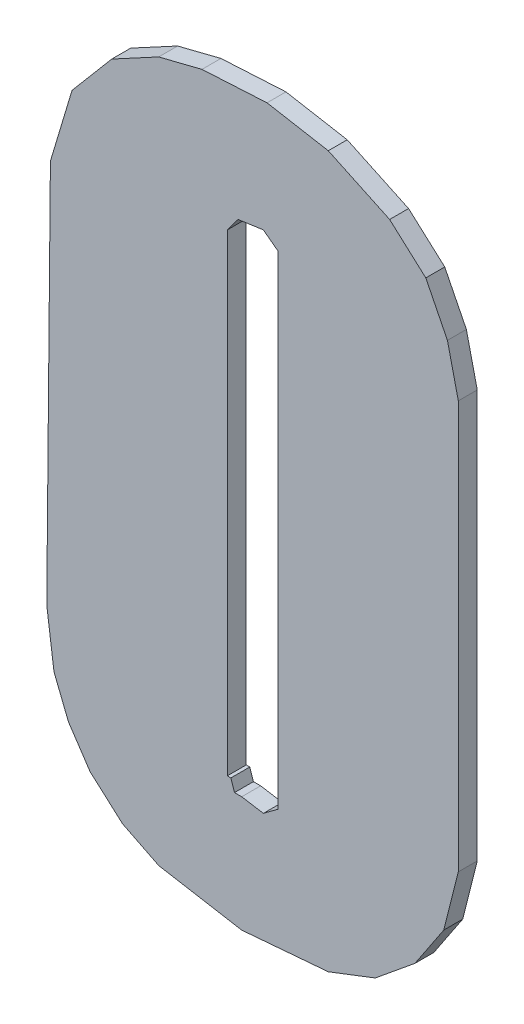
ISO-10303-21;
HEADER;
FILE_DESCRIPTION(('STEP AP214'),'2;1');
FILE_NAME('part.step','',(''),(''),'','','');
FILE_SCHEMA(('AUTOMOTIVE_DESIGN { 1 0 10303 214 1 1 1 1 }'));
ENDSEC;
DATA;
#1=APPLICATION_CONTEXT('core data for automotive mechanical design processes');
#2=APPLICATION_PROTOCOL_DEFINITION('international standard','automotive_design',2000,#1);
#3=PRODUCT_CONTEXT('',#1,'mechanical');
#4=PRODUCT('Part','Part','',(#3));
#5=PRODUCT_RELATED_PRODUCT_CATEGORY('part','',(#4));
#6=PRODUCT_DEFINITION_FORMATION('','',#4);
#7=PRODUCT_DEFINITION_CONTEXT('part definition',#1,'design');
#8=PRODUCT_DEFINITION('design','',#6,#7);
#9=PRODUCT_DEFINITION_SHAPE('','',#8);
#10=(LENGTH_UNIT() NAMED_UNIT(*) SI_UNIT(.MILLI.,.METRE.));
#11=(NAMED_UNIT(*) PLANE_ANGLE_UNIT() SI_UNIT($,.RADIAN.));
#12=(NAMED_UNIT(*) SI_UNIT($,.STERADIAN.) SOLID_ANGLE_UNIT());
#13=UNCERTAINTY_MEASURE_WITH_UNIT(LENGTH_MEASURE(1.E-05),#10,'distance_accuracy_value','');
#14=(GEOMETRIC_REPRESENTATION_CONTEXT(3) GLOBAL_UNCERTAINTY_ASSIGNED_CONTEXT((#13)) GLOBAL_UNIT_ASSIGNED_CONTEXT((#10,
#11,#12)) REPRESENTATION_CONTEXT('',''));
#15=CARTESIAN_POINT('',(0.,0.,0.));
#16=DIRECTION('',(0.,0.,1.));
#17=DIRECTION('',(1.,0.,0.));
#18=AXIS2_PLACEMENT_3D('',#15,#16,#17);
#19=CARTESIAN_POINT('',(0.,0.,0.05));
#20=DIRECTION('',(0.,0.,1.));
#21=DIRECTION('',(1.,0.,0.));
#22=AXIS2_PLACEMENT_3D('',#19,#20,#21);
#23=PLANE('',#22);
#24=DIRECTION('',(0.,1.,0.));
#25=VECTOR('',#24,1.);
#26=CARTESIAN_POINT('',(0.524256,0.767334,0.05));
#27=LINE('',#26,#25);
#28=CARTESIAN_POINT('',(0.524256,-0.510032,0.05));
#29=VERTEX_POINT('',#28);
#30=CARTESIAN_POINT('',(0.524256,0.767334,0.05));
#31=VERTEX_POINT('',#30);
#32=EDGE_CURVE('E373',#29,#31,#27,.T.);
#33=ORIENTED_EDGE('',*,*,#32,.F.);
#34=DIRECTION('',(-0.801280222077692,-0.598289232484694,0.));
#35=VECTOR('',#34,1.);
#36=CARTESIAN_POINT('',(0.524256,-0.510032,0.05));
#37=LINE('',#36,#35);
#38=CARTESIAN_POINT('',(0.486156,-0.53848,0.05));
#39=VERTEX_POINT('',#38);
#40=EDGE_CURVE('E336',#39,#29,#37,.F.);
#41=ORIENTED_EDGE('',*,*,#40,.F.);
#42=DIRECTION('',(-0.986747201085782,0.162265095289697,0.));
#43=VECTOR('',#42,1.);
#44=CARTESIAN_POINT('',(0.486156,-0.53848,0.05));
#45=LINE('',#44,#43);
#46=CARTESIAN_POINT('',(0.429006,-0.529081999999999,0.05));
#47=VERTEX_POINT('',#46);
#48=EDGE_CURVE('E338',#47,#39,#45,.F.);
#49=ORIENTED_EDGE('',*,*,#48,.F.);
#50=DIRECTION('',(1.,0.,0.));
#51=VECTOR('',#50,1.);
#52=CARTESIAN_POINT('',(0.429006,-0.529082,0.05));
#53=LINE('',#52,#51);
#54=CARTESIAN_POINT('',(0.409956,-0.529082,0.05));
#55=VERTEX_POINT('',#54);
#56=EDGE_CURVE('E342',#55,#47,#53,.T.);
#57=ORIENTED_EDGE('',*,*,#56,.F.);
#58=DIRECTION('',(-0.318743046023901,0.947841163176302,0.));
#59=VECTOR('',#58,1.);
#60=CARTESIAN_POINT('',(0.409956,-0.529082,0.05));
#61=LINE('',#60,#59);
#62=CARTESIAN_POINT('',(0.400304,-0.50038,0.05));
#63=VERTEX_POINT('',#62);
#64=EDGE_CURVE('E346',#63,#55,#61,.F.);
#65=ORIENTED_EDGE('',*,*,#64,.F.);
#66=DIRECTION('',(1.,0.,0.));
#67=VECTOR('',#66,1.);
#68=CARTESIAN_POINT('',(0.400304,-0.50038,0.05));
#69=LINE('',#68,#67);
#70=CARTESIAN_POINT('',(0.390906,-0.50038,0.05));
#71=VERTEX_POINT('',#70);
#72=EDGE_CURVE('E350',#71,#63,#69,.T.);
#73=ORIENTED_EDGE('',*,*,#72,.F.);
#74=DIRECTION('',(0.,1.,0.));
#75=VECTOR('',#74,1.);
#76=CARTESIAN_POINT('',(0.390906,-0.50038,0.05));
#77=LINE('',#76,#75);
#78=CARTESIAN_POINT('',(0.390906,0.748284,0.05));
#79=VERTEX_POINT('',#78);
#80=EDGE_CURVE('E354',#79,#71,#77,.F.);
#81=ORIENTED_EDGE('',*,*,#80,.F.);
#82=DIRECTION('',(0.598289232484694,0.801280222077692,0.));
#83=VECTOR('',#82,1.);
#84=CARTESIAN_POINT('',(0.390906,0.748284,0.05));
#85=LINE('',#84,#83);
#86=CARTESIAN_POINT('',(0.419354,0.786384,0.05));
#87=VERTEX_POINT('',#86);
#88=EDGE_CURVE('E358',#87,#79,#85,.F.);
#89=ORIENTED_EDGE('',*,*,#88,.F.);
#90=DIRECTION('',(0.989722439725848,0.143001721329207,0.));
#91=VECTOR('',#90,1.);
#92=CARTESIAN_POINT('',(0.419354,0.786384,0.05));
#93=LINE('',#92,#91);
#94=CARTESIAN_POINT('',(0.486156,0.796036,0.05));
#95=VERTEX_POINT('',#94);
#96=EDGE_CURVE('E362',#95,#87,#93,.F.);
#97=ORIENTED_EDGE('',*,*,#96,.F.);
#98=DIRECTION('',(0.798720233000385,-0.601702575526989,0.));
#99=VECTOR('',#98,1.);
#100=CARTESIAN_POINT('',(0.486156,0.796036,0.05));
#101=LINE('',#100,#99);
#102=EDGE_CURVE('E366',#31,#95,#101,.F.);
#103=ORIENTED_EDGE('',*,*,#102,.F.);
#104=EDGE_LOOP('',(#33,#41,#49,#57,#65,#73,#81,#89,#97,#103));
#105=FACE_BOUND('',#104,.T.);
#106=DIRECTION('',(-0.984627554019224,0.174667054323704,0.));
#107=VECTOR('',#106,1.);
#108=CARTESIAN_POINT('',(0.657606,1.062736,0.05));
#109=LINE('',#108,#107);
#110=CARTESIAN_POINT('',(0.495808,1.091438,0.05));
#111=VERTEX_POINT('',#110);
#112=CARTESIAN_POINT('',(0.657606,1.062736,0.05));
#113=VERTEX_POINT('',#112);
#114=EDGE_CURVE('E244',#111,#113,#109,.F.);
#115=ORIENTED_EDGE('',*,*,#114,.F.);
#116=DIRECTION('',(-0.998505466653823,-0.0546519264292812,0.));
#117=VECTOR('',#116,1.);
#118=CARTESIAN_POINT('',(0.495808,1.091438,0.05));
#119=LINE('',#118,#117);
#120=CARTESIAN_POINT('',(0.324104000000001,1.08204,0.05));
#121=VERTEX_POINT('',#120);
#122=EDGE_CURVE('E20',#121,#111,#119,.F.);
#123=ORIENTED_EDGE('',*,*,#122,.F.);
#124=DIRECTION('',(-0.969888404354917,-0.243549754871304,0.));
#125=VECTOR('',#124,1.);
#126=CARTESIAN_POINT('',(0.324104,1.08204,0.05));
#127=LINE('',#126,#125);
#128=CARTESIAN_POINT('',(0.209804,1.053338,0.05));
#129=VERTEX_POINT('',#128);
#130=EDGE_CURVE('E233',#129,#121,#127,.F.);
#131=ORIENTED_EDGE('',*,*,#130,.F.);
#132=DIRECTION('',(-0.880297271767712,-0.474422505071506,0.));
#133=VECTOR('',#132,1.);
#134=CARTESIAN_POINT('',(0.209804,1.053338,0.05));
#135=LINE('',#134,#133);
#136=CARTESIAN_POINT('',(0.0858519999999996,0.986536000000001,0.05));
#137=VERTEX_POINT('',#136);
#138=EDGE_CURVE('E228',#137,#129,#135,.F.);
#139=ORIENTED_EDGE('',*,*,#138,.F.);
#140=DIRECTION('',(-0.646012357808284,-0.763326950630581,0.));
#141=VECTOR('',#140,1.);
#142=CARTESIAN_POINT('',(0.085852,0.986536,0.05));
#143=LINE('',#142,#141);
#144=CARTESIAN_POINT('',(-0.0190500000000006,0.862584000000001,0.05));
#145=VERTEX_POINT('',#144);
#146=EDGE_CURVE('E255',#145,#137,#143,.F.);
#147=ORIENTED_EDGE('',*,*,#146,.F.);
#148=DIRECTION('',(-0.28734788556629,-0.957826285221168,0.));
#149=VECTOR('',#148,1.);
#150=CARTESIAN_POINT('',(-0.01905,0.862584,0.05));
#151=LINE('',#150,#149);
#152=CARTESIAN_POINT('',(-0.0761999999999972,0.672084,0.05));
#153=VERTEX_POINT('',#152);
#154=EDGE_CURVE('E259',#153,#145,#151,.F.);
#155=ORIENTED_EDGE('',*,*,#154,.F.);
#156=DIRECTION('',(-0.00946172783873184,-0.999955236851283,0.));
#157=VECTOR('',#156,1.);
#158=CARTESIAN_POINT('',(-0.0762,0.672084,0.05));
#159=LINE('',#158,#157);
#160=CARTESIAN_POINT('',(-0.0858519999999995,-0.347980000000007,0.05));
#161=VERTEX_POINT('',#160);
#162=EDGE_CURVE('E263',#161,#153,#159,.F.);
#163=ORIENTED_EDGE('',*,*,#162,.F.);
#164=DIRECTION('',(0.132048393088995,-0.991243270788062,0.));
#165=VECTOR('',#164,1.);
#166=CARTESIAN_POINT('',(-0.085852,-0.34798,0.05));
#167=LINE('',#166,#165);
#168=CARTESIAN_POINT('',(-0.066802,-0.490982,0.05));
#169=VERTEX_POINT('',#168);
#170=EDGE_CURVE('E267',#169,#161,#167,.F.);
#171=ORIENTED_EDGE('',*,*,#170,.F.);
#172=DIRECTION('',(0.371390676354086,-0.928476690885266,0.));
#173=VECTOR('',#172,1.);
#174=CARTESIAN_POINT('',(-0.066802,-0.490982,0.05));
#175=LINE('',#174,#173);
#176=CARTESIAN_POINT('',(-0.0287020000000005,-0.586232,0.05));
#177=VERTEX_POINT('',#176);
#178=EDGE_CURVE('E271',#177,#169,#175,.F.);
#179=ORIENTED_EDGE('',*,*,#178,.F.);
#180=DIRECTION('',(0.55583480897272,-0.83129276740163,0.));
#181=VECTOR('',#180,1.);
#182=CARTESIAN_POINT('',(-0.028702,-0.586232,0.05));
#183=LINE('',#182,#181);
#184=CARTESIAN_POINT('',(0.0287020000000005,-0.672084,0.05));
#185=VERTEX_POINT('',#184);
#186=EDGE_CURVE('E275',#185,#177,#183,.F.);
#187=ORIENTED_EDGE('',*,*,#186,.F.);
#188=DIRECTION('',(0.746919984028379,-0.664913932369481,0.));
#189=VECTOR('',#188,1.);
#190=CARTESIAN_POINT('',(0.028702,-0.672084,0.05));
#191=LINE('',#190,#189);
#192=CARTESIAN_POINT('',(0.1143,-0.748284,0.05));
#193=VERTEX_POINT('',#192);
#194=EDGE_CURVE('E279',#193,#185,#191,.F.);
#195=ORIENTED_EDGE('',*,*,#194,.F.);
#196=DIRECTION('',(0.894427190999896,-0.447213595499998,0.));
#197=VECTOR('',#196,1.);
#198=CARTESIAN_POINT('',(0.1143,-0.748284,0.05));
#199=LINE('',#198,#197);
#200=CARTESIAN_POINT('',(0.209803999999999,-0.796036000000001,0.05));
#201=VERTEX_POINT('',#200);
#202=EDGE_CURVE('E283',#201,#193,#199,.F.);
#203=ORIENTED_EDGE('',*,*,#202,.F.);
#204=DIRECTION('',(0.985228508010041,-0.171244815992507,0.));
#205=VECTOR('',#204,1.);
#206=CARTESIAN_POINT('',(0.209804,-0.796036,0.05));
#207=LINE('',#206,#205);
#208=CARTESIAN_POINT('',(0.429005999999999,-0.834136000000002,0.05));
#209=VERTEX_POINT('',#208);
#210=EDGE_CURVE('E287',#209,#201,#207,.F.);
#211=ORIENTED_EDGE('',*,*,#210,.F.);
#212=DIRECTION('',(0.99654575824488,0.0830454798537383,0.));
#213=VECTOR('',#212,1.);
#214=CARTESIAN_POINT('',(0.429006,-0.834136,0.05));
#215=LINE('',#214,#213);
#216=CARTESIAN_POINT('',(0.657606,-0.815086,0.05));
#217=VERTEX_POINT('',#216);
#218=EDGE_CURVE('E291',#217,#209,#215,.F.);
#219=ORIENTED_EDGE('',*,*,#218,.F.);
#220=DIRECTION('',(0.933148332563333,0.359491570741613,0.));
#221=VECTOR('',#220,1.);
#222=CARTESIAN_POINT('',(0.657606,-0.815086,0.05));
#223=LINE('',#222,#221);
#224=CARTESIAN_POINT('',(0.781558,-0.767334,0.05));
#225=VERTEX_POINT('',#224);
#226=EDGE_CURVE('E295',#225,#217,#223,.F.);
#227=ORIENTED_EDGE('',*,*,#226,.F.);
#228=DIRECTION('',(0.77387380694181,0.633339822630308,0.));
#229=VECTOR('',#228,1.);
#230=CARTESIAN_POINT('',(0.781558,-0.767334,0.05));
#231=LINE('',#230,#229);
#232=CARTESIAN_POINT('',(0.886460000000001,-0.681482000000001,0.05));
#233=VERTEX_POINT('',#232);
#234=EDGE_CURVE('E299',#233,#225,#231,.F.);
#235=ORIENTED_EDGE('',*,*,#234,.F.);
#236=DIRECTION('',(0.554700196225229,0.832050294337844,0.));
#237=VECTOR('',#236,1.);
#238=CARTESIAN_POINT('',(0.88646,-0.681482,0.05));
#239=LINE('',#238,#237);
#240=CARTESIAN_POINT('',(0.96266,-0.567182,0.05));
#241=VERTEX_POINT('',#240);
#242=EDGE_CURVE('E303',#241,#233,#239,.F.);
#243=ORIENTED_EDGE('',*,*,#242,.F.);
#244=DIRECTION('',(0.244056520619899,0.969761009085697,0.));
#245=VECTOR('',#244,1.);
#246=CARTESIAN_POINT('',(0.96266,-0.567182,0.05));
#247=LINE('',#246,#245);
#248=CARTESIAN_POINT('',(1.001014,-0.414782,0.05));
#249=VERTEX_POINT('',#248);
#250=EDGE_CURVE('E307',#249,#241,#247,.F.);
#251=ORIENTED_EDGE('',*,*,#250,.F.);
#252=DIRECTION('',(0.,1.,0.));
#253=VECTOR('',#252,1.);
#254=CARTESIAN_POINT('',(1.001014,-0.414782,0.05));
#255=LINE('',#254,#253);
#256=CARTESIAN_POINT('',(1.001014,0.662432,0.05));
#257=VERTEX_POINT('',#256);
#258=EDGE_CURVE('E311',#257,#249,#255,.F.);
#259=ORIENTED_EDGE('',*,*,#258,.F.);
#260=DIRECTION('',(-0.225588450890602,0.974222690571708,0.));
#261=VECTOR('',#260,1.);
#262=CARTESIAN_POINT('',(1.001014,0.662432,0.05));
#263=LINE('',#262,#261);
#264=CARTESIAN_POINT('',(0.972312,0.786383999999999,0.05));
#265=VERTEX_POINT('',#264);
#266=EDGE_CURVE('E315',#265,#257,#263,.F.);
#267=ORIENTED_EDGE('',*,*,#266,.F.);
#268=DIRECTION('',(-0.447213595499998,0.894427190999896,0.));
#269=VECTOR('',#268,1.);
#270=CARTESIAN_POINT('',(0.972312,0.786384,0.05));
#271=LINE('',#270,#269);
#272=CARTESIAN_POINT('',(0.915161999999999,0.900683999999999,0.05));
#273=VERTEX_POINT('',#272);
#274=EDGE_CURVE('E319',#273,#265,#271,.F.);
#275=ORIENTED_EDGE('',*,*,#274,.F.);
#276=DIRECTION('',(-0.743687410619032,0.668527512737329,0.));
#277=VECTOR('',#276,1.);
#278=CARTESIAN_POINT('',(0.915162,0.900684,0.05));
#279=LINE('',#278,#277);
#280=CARTESIAN_POINT('',(0.819658,0.986536,0.05));
#281=VERTEX_POINT('',#280);
#282=EDGE_CURVE('E323',#281,#273,#279,.F.);
#283=ORIENTED_EDGE('',*,*,#282,.F.);
#284=DIRECTION('',(-0.904947242258156,0.425523781626079,0.));
#285=VECTOR('',#284,1.);
#286=CARTESIAN_POINT('',(0.819658,0.986536,0.05));
#287=LINE('',#286,#285);
#288=EDGE_CURVE('E327',#113,#281,#287,.F.);
#289=ORIENTED_EDGE('',*,*,#288,.F.);
#290=EDGE_LOOP('',(#115,#123,#131,#139,#147,#155,#163,#171,#179,#187,#195,#203,#211,#219,#227,
#235,#243,#251,#259,#267,#275,#283,#289));
#291=FACE_BOUND('',#290,.T.);
#292=ADVANCED_FACE('F17',(#105,#291),#23,.T.);
#293=CARTESIAN_POINT('',(0.495808,1.091438,0.));
#294=DIRECTION('',(-0.0546519264292812,0.998505466653823,0.));
#295=DIRECTION('',(-0.998505466653823,-0.0546519264292812,0.));
#296=AXIS2_PLACEMENT_3D('',#293,#294,#295);
#297=PLANE('',#296);
#298=DIRECTION('',(0.,0.,1.));
#299=VECTOR('',#298,1.);
#300=CARTESIAN_POINT('',(0.495808000000001,1.09143800000001,0.));
#301=LINE('',#300,#299);
#302=CARTESIAN_POINT('',(0.495808,1.091438,0.));
#303=VERTEX_POINT('',#302);
#304=EDGE_CURVE('E331',#303,#111,#301,.T.);
#305=ORIENTED_EDGE('',*,*,#304,.F.);
#306=DIRECTION('',(-0.998505466653823,-0.0546519264292778,0.));
#307=VECTOR('',#306,1.);
#308=CARTESIAN_POINT('',(0.495808,1.091438,0.));
#309=LINE('',#308,#307);
#310=CARTESIAN_POINT('',(0.324104,1.08204,0.));
#311=VERTEX_POINT('',#310);
#312=EDGE_CURVE('E250',#303,#311,#309,.T.);
#313=ORIENTED_EDGE('',*,*,#312,.T.);
#314=DIRECTION('',(0.,0.,1.));
#315=VECTOR('',#314,1.);
#316=CARTESIAN_POINT('',(0.324104,1.08204,0.));
#317=LINE('',#316,#315);
#318=EDGE_CURVE('E238',#121,#311,#317,.F.);
#319=ORIENTED_EDGE('',*,*,#318,.F.);
#320=ORIENTED_EDGE('',*,*,#122,.T.);
#321=EDGE_LOOP('',(#305,#313,#319,#320));
#322=FACE_BOUND('',#321,.T.);
#323=ADVANCED_FACE('F249',(#322),#297,.T.);
#324=CARTESIAN_POINT('',(0.324104,1.08204,0.));
#325=DIRECTION('',(-0.243549754871304,0.969888404354917,0.));
#326=DIRECTION('',(-0.969888404354917,-0.243549754871304,0.));
#327=AXIS2_PLACEMENT_3D('',#324,#325,#326);
#328=PLANE('',#327);
#329=ORIENTED_EDGE('',*,*,#318,.T.);
#330=DIRECTION('',(-0.969888404354908,-0.24354975487134,0.));
#331=VECTOR('',#330,1.);
#332=CARTESIAN_POINT('',(0.324104,1.08204,0.));
#333=LINE('',#332,#331);
#334=CARTESIAN_POINT('',(0.209803999999999,1.053338,0.));
#335=VERTEX_POINT('',#334);
#336=EDGE_CURVE('E377',#311,#335,#333,.T.);
#337=ORIENTED_EDGE('',*,*,#336,.T.);
#338=DIRECTION('',(0.,0.,1.));
#339=VECTOR('',#338,1.);
#340=CARTESIAN_POINT('',(0.209804,1.053338,0.));
#341=LINE('',#340,#339);
#342=EDGE_CURVE('E240',#129,#335,#341,.F.);
#343=ORIENTED_EDGE('',*,*,#342,.F.);
#344=ORIENTED_EDGE('',*,*,#130,.T.);
#345=EDGE_LOOP('',(#329,#337,#343,#344));
#346=FACE_BOUND('',#345,.T.);
#347=ADVANCED_FACE('F235',(#346),#328,.T.);
#348=CARTESIAN_POINT('',(0.209804,1.053338,0.));
#349=DIRECTION('',(-0.474422505071506,0.880297271767712,0.));
#350=DIRECTION('',(-0.880297271767712,-0.474422505071506,0.));
#351=AXIS2_PLACEMENT_3D('',#348,#349,#350);
#352=PLANE('',#351);
#353=ORIENTED_EDGE('',*,*,#342,.T.);
#354=DIRECTION('',(-0.8802972717677,-0.474422505071528,0.));
#355=VECTOR('',#354,1.);
#356=CARTESIAN_POINT('',(0.209804,1.053338,0.));
#357=LINE('',#356,#355);
#358=CARTESIAN_POINT('',(0.0858519999999992,0.986536000000002,0.));
#359=VERTEX_POINT('',#358);
#360=EDGE_CURVE('E379',#335,#359,#357,.T.);
#361=ORIENTED_EDGE('',*,*,#360,.T.);
#362=DIRECTION('',(0.,0.,1.));
#363=VECTOR('',#362,1.);
#364=CARTESIAN_POINT('',(0.085852,0.986536,0.));
#365=LINE('',#364,#363);
#366=EDGE_CURVE('E257',#137,#359,#365,.F.);
#367=ORIENTED_EDGE('',*,*,#366,.F.);
#368=ORIENTED_EDGE('',*,*,#138,.T.);
#369=EDGE_LOOP('',(#353,#361,#367,#368));
#370=FACE_BOUND('',#369,.T.);
#371=ADVANCED_FACE('F620',(#370),#352,.T.);
#372=CARTESIAN_POINT('',(0.085852,0.986536,0.));
#373=DIRECTION('',(-0.763326950630581,0.646012357808284,0.));
#374=DIRECTION('',(-0.646012357808284,-0.763326950630581,0.));
#375=AXIS2_PLACEMENT_3D('',#372,#373,#374);
#376=PLANE('',#375);
#377=ORIENTED_EDGE('',*,*,#366,.T.);
#378=DIRECTION('',(-0.646012357808269,-0.763326950630594,0.));
#379=VECTOR('',#378,1.);
#380=CARTESIAN_POINT('',(0.085852,0.986536,0.));
#381=LINE('',#380,#379);
#382=CARTESIAN_POINT('',(-0.0190500000000012,0.862584000000001,0.));
#383=VERTEX_POINT('',#382);
#384=EDGE_CURVE('E382',#359,#383,#381,.T.);
#385=ORIENTED_EDGE('',*,*,#384,.T.);
#386=DIRECTION('',(0.,0.,1.));
#387=VECTOR('',#386,1.);
#388=CARTESIAN_POINT('',(-0.01905,0.862584,0.));
#389=LINE('',#388,#387);
#390=EDGE_CURVE('E261',#145,#383,#389,.F.);
#391=ORIENTED_EDGE('',*,*,#390,.F.);
#392=ORIENTED_EDGE('',*,*,#146,.T.);
#393=EDGE_LOOP('',(#377,#385,#391,#392));
#394=FACE_BOUND('',#393,.T.);
#395=ADVANCED_FACE('F616',(#394),#376,.T.);
#396=CARTESIAN_POINT('',(-0.01905,0.862584,0.));
#397=DIRECTION('',(-0.957826285221168,0.28734788556629,0.));
#398=DIRECTION('',(-0.28734788556629,-0.957826285221168,0.));
#399=AXIS2_PLACEMENT_3D('',#396,#397,#398);
#400=PLANE('',#399);
#401=ORIENTED_EDGE('',*,*,#390,.T.);
#402=DIRECTION('',(-0.287347885566345,-0.957826285221151,0.));
#403=VECTOR('',#402,1.);
#404=CARTESIAN_POINT('',(-0.01905,0.862584,0.));
#405=LINE('',#404,#403);
#406=CARTESIAN_POINT('',(-0.0761999999999945,0.672083999999999,0.));
#407=VERTEX_POINT('',#406);
#408=EDGE_CURVE('E385',#383,#407,#405,.T.);
#409=ORIENTED_EDGE('',*,*,#408,.T.);
#410=DIRECTION('',(0.,0.,1.));
#411=VECTOR('',#410,1.);
#412=CARTESIAN_POINT('',(-0.0762,0.672084,0.));
#413=LINE('',#412,#411);
#414=EDGE_CURVE('E265',#153,#407,#413,.F.);
#415=ORIENTED_EDGE('',*,*,#414,.F.);
#416=ORIENTED_EDGE('',*,*,#154,.T.);
#417=EDGE_LOOP('',(#401,#409,#415,#416));
#418=FACE_BOUND('',#417,.T.);
#419=ADVANCED_FACE('F612',(#418),#400,.T.);
#420=CARTESIAN_POINT('',(-0.0762,0.672084,0.));
#421=DIRECTION('',(-0.999955236851283,0.00946172783873184,0.));
#422=DIRECTION('',(-0.00946172783873184,-0.999955236851283,0.));
#423=AXIS2_PLACEMENT_3D('',#420,#421,#422);
#424=PLANE('',#423);
#425=ORIENTED_EDGE('',*,*,#414,.T.);
#426=DIRECTION('',(-0.00946172783873226,-0.999955236851283,0.));
#427=VECTOR('',#426,1.);
#428=CARTESIAN_POINT('',(-0.0762,0.672084,0.));
#429=LINE('',#428,#427);
#430=CARTESIAN_POINT('',(-0.0858519999999996,-0.347980000000004,0.));
#431=VERTEX_POINT('',#430);
#432=EDGE_CURVE('E388',#407,#431,#429,.T.);
#433=ORIENTED_EDGE('',*,*,#432,.T.);
#434=DIRECTION('',(0.,0.,1.));
#435=VECTOR('',#434,1.);
#436=CARTESIAN_POINT('',(-0.085852,-0.34798,0.));
#437=LINE('',#436,#435);
#438=EDGE_CURVE('E269',#161,#431,#437,.F.);
#439=ORIENTED_EDGE('',*,*,#438,.F.);
#440=ORIENTED_EDGE('',*,*,#162,.T.);
#441=EDGE_LOOP('',(#425,#433,#439,#440));
#442=FACE_BOUND('',#441,.T.);
#443=ADVANCED_FACE('F608',(#442),#424,.T.);
#444=CARTESIAN_POINT('',(-0.085852,-0.34798,0.));
#445=DIRECTION('',(-0.991243270788062,-0.132048393088995,0.));
#446=DIRECTION('',(0.132048393088995,-0.991243270788062,0.));
#447=AXIS2_PLACEMENT_3D('',#444,#445,#446);
#448=PLANE('',#447);
#449=ORIENTED_EDGE('',*,*,#438,.T.);
#450=DIRECTION('',(0.132048393088996,-0.991243270788061,0.));
#451=VECTOR('',#450,1.);
#452=CARTESIAN_POINT('',(-0.085852,-0.34798,0.));
#453=LINE('',#452,#451);
#454=CARTESIAN_POINT('',(-0.0668020000000001,-0.490982,0.));
#455=VERTEX_POINT('',#454);
#456=EDGE_CURVE('E391',#431,#455,#453,.T.);
#457=ORIENTED_EDGE('',*,*,#456,.T.);
#458=DIRECTION('',(0.,0.,1.));
#459=VECTOR('',#458,1.);
#460=CARTESIAN_POINT('',(-0.066802,-0.490982,0.));
#461=LINE('',#460,#459);
#462=EDGE_CURVE('E273',#169,#455,#461,.F.);
#463=ORIENTED_EDGE('',*,*,#462,.F.);
#464=ORIENTED_EDGE('',*,*,#170,.T.);
#465=EDGE_LOOP('',(#449,#457,#463,#464));
#466=FACE_BOUND('',#465,.T.);
#467=ADVANCED_FACE('F604',(#466),#448,.T.);
#468=CARTESIAN_POINT('',(-0.066802,-0.490982,0.));
#469=DIRECTION('',(-0.928476690885266,-0.371390676354086,0.));
#470=DIRECTION('',(0.371390676354086,-0.928476690885266,0.));
#471=AXIS2_PLACEMENT_3D('',#468,#469,#470);
#472=PLANE('',#471);
#473=ORIENTED_EDGE('',*,*,#462,.T.);
#474=DIRECTION('',(0.371390676354103,-0.928476690885259,0.));
#475=VECTOR('',#474,1.);
#476=CARTESIAN_POINT('',(-0.066802,-0.490982,0.));
#477=LINE('',#476,#475);
#478=CARTESIAN_POINT('',(-0.0287020000000009,-0.586232,0.));
#479=VERTEX_POINT('',#478);
#480=EDGE_CURVE('E394',#455,#479,#477,.T.);
#481=ORIENTED_EDGE('',*,*,#480,.T.);
#482=DIRECTION('',(0.,0.,1.));
#483=VECTOR('',#482,1.);
#484=CARTESIAN_POINT('',(-0.028702,-0.586232,0.));
#485=LINE('',#484,#483);
#486=EDGE_CURVE('E277',#177,#479,#485,.F.);
#487=ORIENTED_EDGE('',*,*,#486,.F.);
#488=ORIENTED_EDGE('',*,*,#178,.T.);
#489=EDGE_LOOP('',(#473,#481,#487,#488));
#490=FACE_BOUND('',#489,.T.);
#491=ADVANCED_FACE('F600',(#490),#472,.T.);
#492=CARTESIAN_POINT('',(-0.028702,-0.586232,0.));
#493=DIRECTION('',(-0.83129276740163,-0.55583480897272,0.));
#494=DIRECTION('',(0.55583480897272,-0.83129276740163,0.));
#495=AXIS2_PLACEMENT_3D('',#492,#493,#494);
#496=PLANE('',#495);
#497=ORIENTED_EDGE('',*,*,#486,.T.);
#498=DIRECTION('',(0.555834808972697,-0.831292767401645,0.));
#499=VECTOR('',#498,1.);
#500=CARTESIAN_POINT('',(-0.028702,-0.586232,0.));
#501=LINE('',#500,#499);
#502=CARTESIAN_POINT('',(0.0287020000000011,-0.672083999999999,0.));
#503=VERTEX_POINT('',#502);
#504=EDGE_CURVE('E397',#479,#503,#501,.T.);
#505=ORIENTED_EDGE('',*,*,#504,.T.);
#506=DIRECTION('',(0.,0.,1.));
#507=VECTOR('',#506,1.);
#508=CARTESIAN_POINT('',(0.028702,-0.672084,0.));
#509=LINE('',#508,#507);
#510=EDGE_CURVE('E281',#185,#503,#509,.F.);
#511=ORIENTED_EDGE('',*,*,#510,.F.);
#512=ORIENTED_EDGE('',*,*,#186,.T.);
#513=EDGE_LOOP('',(#497,#505,#511,#512));
#514=FACE_BOUND('',#513,.T.);
#515=ADVANCED_FACE('F596',(#514),#496,.T.);
#516=CARTESIAN_POINT('',(0.028702,-0.672084,0.));
#517=DIRECTION('',(-0.664913932369481,-0.746919984028379,0.));
#518=DIRECTION('',(0.746919984028379,-0.664913932369481,0.));
#519=AXIS2_PLACEMENT_3D('',#516,#517,#518);
#520=PLANE('',#519);
#521=ORIENTED_EDGE('',*,*,#510,.T.);
#522=DIRECTION('',(0.746919984028381,-0.664913932369478,0.));
#523=VECTOR('',#522,1.);
#524=CARTESIAN_POINT('',(0.028702,-0.672084,0.));
#525=LINE('',#524,#523);
#526=CARTESIAN_POINT('',(0.1143,-0.748284,0.));
#527=VERTEX_POINT('',#526);
#528=EDGE_CURVE('E400',#503,#527,#525,.T.);
#529=ORIENTED_EDGE('',*,*,#528,.T.);
#530=DIRECTION('',(0.,0.,1.));
#531=VECTOR('',#530,1.);
#532=CARTESIAN_POINT('',(0.1143,-0.748284,0.));
#533=LINE('',#532,#531);
#534=EDGE_CURVE('E285',#193,#527,#533,.F.);
#535=ORIENTED_EDGE('',*,*,#534,.F.);
#536=ORIENTED_EDGE('',*,*,#194,.T.);
#537=EDGE_LOOP('',(#521,#529,#535,#536));
#538=FACE_BOUND('',#537,.T.);
#539=ADVANCED_FACE('F592',(#538),#520,.T.);
#540=CARTESIAN_POINT('',(0.1143,-0.748284,0.));
#541=DIRECTION('',(-0.447213595499998,-0.894427190999896,0.));
#542=DIRECTION('',(0.894427190999896,-0.447213595499998,0.));
#543=AXIS2_PLACEMENT_3D('',#540,#541,#542);
#544=PLANE('',#543);
#545=ORIENTED_EDGE('',*,*,#534,.T.);
#546=DIRECTION('',(0.894427190999916,-0.447213595499958,0.));
#547=VECTOR('',#546,1.);
#548=CARTESIAN_POINT('',(0.1143,-0.748284,0.));
#549=LINE('',#548,#547);
#550=CARTESIAN_POINT('',(0.209803999999999,-0.796036000000002,0.));
#551=VERTEX_POINT('',#550);
#552=EDGE_CURVE('E403',#527,#551,#549,.T.);
#553=ORIENTED_EDGE('',*,*,#552,.T.);
#554=DIRECTION('',(0.,0.,1.));
#555=VECTOR('',#554,1.);
#556=CARTESIAN_POINT('',(0.209804,-0.796036,0.));
#557=LINE('',#556,#555);
#558=EDGE_CURVE('E289',#201,#551,#557,.F.);
#559=ORIENTED_EDGE('',*,*,#558,.F.);
#560=ORIENTED_EDGE('',*,*,#202,.T.);
#561=EDGE_LOOP('',(#545,#553,#559,#560));
#562=FACE_BOUND('',#561,.T.);
#563=ADVANCED_FACE('F588',(#562),#544,.T.);
#564=CARTESIAN_POINT('',(0.209804,-0.796036,0.));
#565=DIRECTION('',(-0.171244815992507,-0.985228508010041,0.));
#566=DIRECTION('',(0.985228508010041,-0.171244815992507,0.));
#567=AXIS2_PLACEMENT_3D('',#564,#565,#566);
#568=PLANE('',#567);
#569=ORIENTED_EDGE('',*,*,#558,.T.);
#570=DIRECTION('',(0.985228508010047,-0.171244815992476,0.));
#571=VECTOR('',#570,1.);
#572=CARTESIAN_POINT('',(0.209804,-0.796036,0.));
#573=LINE('',#572,#571);
#574=CARTESIAN_POINT('',(0.429005999999999,-0.834136000000003,0.));
#575=VERTEX_POINT('',#574);
#576=EDGE_CURVE('E406',#551,#575,#573,.T.);
#577=ORIENTED_EDGE('',*,*,#576,.T.);
#578=DIRECTION('',(0.,0.,1.));
#579=VECTOR('',#578,1.);
#580=CARTESIAN_POINT('',(0.429006,-0.834136,0.));
#581=LINE('',#580,#579);
#582=EDGE_CURVE('E293',#209,#575,#581,.F.);
#583=ORIENTED_EDGE('',*,*,#582,.F.);
#584=ORIENTED_EDGE('',*,*,#210,.T.);
#585=EDGE_LOOP('',(#569,#577,#583,#584));
#586=FACE_BOUND('',#585,.T.);
#587=ADVANCED_FACE('F584',(#586),#568,.T.);
#588=CARTESIAN_POINT('',(0.429006,-0.834136,0.));
#589=DIRECTION('',(0.0830454798537383,-0.99654575824488,0.));
#590=DIRECTION('',(0.99654575824488,0.0830454798537383,0.));
#591=AXIS2_PLACEMENT_3D('',#588,#589,#590);
#592=PLANE('',#591);
#593=ORIENTED_EDGE('',*,*,#582,.T.);
#594=DIRECTION('',(0.99654575824488,0.0830454798537397,0.));
#595=VECTOR('',#594,1.);
#596=CARTESIAN_POINT('',(0.429006,-0.834136,0.));
#597=LINE('',#596,#595);
#598=CARTESIAN_POINT('',(0.657606,-0.815086,0.));
#599=VERTEX_POINT('',#598);
#600=EDGE_CURVE('E409',#575,#599,#597,.T.);
#601=ORIENTED_EDGE('',*,*,#600,.T.);
#602=DIRECTION('',(0.,0.,1.));
#603=VECTOR('',#602,1.);
#604=CARTESIAN_POINT('',(0.657606,-0.815086,0.));
#605=LINE('',#604,#603);
#606=EDGE_CURVE('E297',#217,#599,#605,.F.);
#607=ORIENTED_EDGE('',*,*,#606,.F.);
#608=ORIENTED_EDGE('',*,*,#218,.T.);
#609=EDGE_LOOP('',(#593,#601,#607,#608));
#610=FACE_BOUND('',#609,.T.);
#611=ADVANCED_FACE('F580',(#610),#592,.T.);
#612=CARTESIAN_POINT('',(0.657606,-0.815086,0.));
#613=DIRECTION('',(0.359491570741613,-0.933148332563333,0.));
#614=DIRECTION('',(0.933148332563333,0.359491570741613,0.));
#615=AXIS2_PLACEMENT_3D('',#612,#613,#614);
#616=PLANE('',#615);
#617=ORIENTED_EDGE('',*,*,#606,.T.);
#618=DIRECTION('',(0.933148332563333,0.359491570741612,0.));
#619=VECTOR('',#618,1.);
#620=CARTESIAN_POINT('',(0.657606,-0.815086,0.));
#621=LINE('',#620,#619);
#622=CARTESIAN_POINT('',(0.781558,-0.767334,0.));
#623=VERTEX_POINT('',#622);
#624=EDGE_CURVE('E412',#599,#623,#621,.T.);
#625=ORIENTED_EDGE('',*,*,#624,.T.);
#626=DIRECTION('',(0.,0.,1.));
#627=VECTOR('',#626,1.);
#628=CARTESIAN_POINT('',(0.781558,-0.767334,0.));
#629=LINE('',#628,#627);
#630=EDGE_CURVE('E301',#225,#623,#629,.F.);
#631=ORIENTED_EDGE('',*,*,#630,.F.);
#632=ORIENTED_EDGE('',*,*,#226,.T.);
#633=EDGE_LOOP('',(#617,#625,#631,#632));
#634=FACE_BOUND('',#633,.T.);
#635=ADVANCED_FACE('F576',(#634),#616,.T.);
#636=CARTESIAN_POINT('',(0.781558,-0.767334,0.));
#637=DIRECTION('',(0.633339822630308,-0.77387380694181,0.));
#638=DIRECTION('',(0.77387380694181,0.633339822630308,0.));
#639=AXIS2_PLACEMENT_3D('',#636,#637,#638);
#640=PLANE('',#639);
#641=ORIENTED_EDGE('',*,*,#630,.T.);
#642=DIRECTION('',(0.773873806941793,0.633339822630329,0.));
#643=VECTOR('',#642,1.);
#644=CARTESIAN_POINT('',(0.781558,-0.767334,0.));
#645=LINE('',#644,#643);
#646=CARTESIAN_POINT('',(0.886460000000001,-0.681482000000001,0.));
#647=VERTEX_POINT('',#646);
#648=EDGE_CURVE('E415',#623,#647,#645,.T.);
#649=ORIENTED_EDGE('',*,*,#648,.T.);
#650=DIRECTION('',(0.,0.,1.));
#651=VECTOR('',#650,1.);
#652=CARTESIAN_POINT('',(0.88646,-0.681482,0.));
#653=LINE('',#652,#651);
#654=EDGE_CURVE('E305',#233,#647,#653,.F.);
#655=ORIENTED_EDGE('',*,*,#654,.F.);
#656=ORIENTED_EDGE('',*,*,#234,.T.);
#657=EDGE_LOOP('',(#641,#649,#655,#656));
#658=FACE_BOUND('',#657,.T.);
#659=ADVANCED_FACE('F572',(#658),#640,.T.);
#660=CARTESIAN_POINT('',(0.88646,-0.681482,0.));
#661=DIRECTION('',(0.832050294337844,-0.554700196225229,0.));
#662=DIRECTION('',(0.554700196225229,0.832050294337844,0.));
#663=AXIS2_PLACEMENT_3D('',#660,#661,#662);
#664=PLANE('',#663);
#665=ORIENTED_EDGE('',*,*,#654,.T.);
#666=DIRECTION('',(0.554700196225228,0.832050294337844,0.));
#667=VECTOR('',#666,1.);
#668=CARTESIAN_POINT('',(0.88646,-0.681482,0.));
#669=LINE('',#668,#667);
#670=CARTESIAN_POINT('',(0.96266,-0.567182,0.));
#671=VERTEX_POINT('',#670);
#672=EDGE_CURVE('E418',#647,#671,#669,.T.);
#673=ORIENTED_EDGE('',*,*,#672,.T.);
#674=DIRECTION('',(0.,0.,1.));
#675=VECTOR('',#674,1.);
#676=CARTESIAN_POINT('',(0.96266,-0.567182,0.));
#677=LINE('',#676,#675);
#678=EDGE_CURVE('E309',#241,#671,#677,.F.);
#679=ORIENTED_EDGE('',*,*,#678,.F.);
#680=ORIENTED_EDGE('',*,*,#242,.T.);
#681=EDGE_LOOP('',(#665,#673,#679,#680));
#682=FACE_BOUND('',#681,.T.);
#683=ADVANCED_FACE('F568',(#682),#664,.T.);
#684=CARTESIAN_POINT('',(0.96266,-0.567182,0.));
#685=DIRECTION('',(0.969761009085697,-0.244056520619899,0.));
#686=DIRECTION('',(0.244056520619899,0.969761009085697,0.));
#687=AXIS2_PLACEMENT_3D('',#684,#685,#686);
#688=PLANE('',#687);
#689=ORIENTED_EDGE('',*,*,#678,.T.);
#690=DIRECTION('',(0.244056520619902,0.969761009085696,0.));
#691=VECTOR('',#690,1.);
#692=CARTESIAN_POINT('',(0.96266,-0.567182,0.));
#693=LINE('',#692,#691);
#694=CARTESIAN_POINT('',(1.001014,-0.414782,0.));
#695=VERTEX_POINT('',#694);
#696=EDGE_CURVE('E421',#671,#695,#693,.T.);
#697=ORIENTED_EDGE('',*,*,#696,.T.);
#698=DIRECTION('',(0.,0.,-1.));
#699=VECTOR('',#698,1.);
#700=CARTESIAN_POINT('',(1.001014,-0.414782,0.));
#701=LINE('',#700,#699);
#702=EDGE_CURVE('E313',#249,#695,#701,.T.);
#703=ORIENTED_EDGE('',*,*,#702,.F.);
#704=ORIENTED_EDGE('',*,*,#250,.T.);
#705=EDGE_LOOP('',(#689,#697,#703,#704));
#706=FACE_BOUND('',#705,.T.);
#707=ADVANCED_FACE('F564',(#706),#688,.T.);
#708=CARTESIAN_POINT('',(1.001014,-0.414782,0.));
#709=DIRECTION('',(1.,0.,0.));
#710=DIRECTION('',(0.,0.,-1.));
#711=AXIS2_PLACEMENT_3D('',#708,#709,#710);
#712=PLANE('',#711);
#713=ORIENTED_EDGE('',*,*,#702,.T.);
#714=DIRECTION('',(0.,1.,0.));
#715=VECTOR('',#714,1.);
#716=CARTESIAN_POINT('',(1.001014,0.,0.));
#717=LINE('',#716,#715);
#718=CARTESIAN_POINT('',(1.001014,0.662432,0.));
#719=VERTEX_POINT('',#718);
#720=EDGE_CURVE('E424',#695,#719,#717,.T.);
#721=ORIENTED_EDGE('',*,*,#720,.T.);
#722=DIRECTION('',(0.,0.,1.));
#723=VECTOR('',#722,1.);
#724=CARTESIAN_POINT('',(1.001014,0.662432,0.));
#725=LINE('',#724,#723);
#726=EDGE_CURVE('E317',#257,#719,#725,.F.);
#727=ORIENTED_EDGE('',*,*,#726,.F.);
#728=ORIENTED_EDGE('',*,*,#258,.T.);
#729=EDGE_LOOP('',(#713,#721,#727,#728));
#730=FACE_BOUND('',#729,.T.);
#731=ADVANCED_FACE('F560',(#730),#712,.T.);
#732=CARTESIAN_POINT('',(1.001014,0.662432,0.));
#733=DIRECTION('',(0.974222690571708,0.225588450890602,0.));
#734=DIRECTION('',(-0.225588450890602,0.974222690571708,0.));
#735=AXIS2_PLACEMENT_3D('',#732,#733,#734);
#736=PLANE('',#735);
#737=ORIENTED_EDGE('',*,*,#726,.T.);
#738=DIRECTION('',(-0.225588450890582,0.974222690571713,0.));
#739=VECTOR('',#738,1.);
#740=CARTESIAN_POINT('',(1.001014,0.662432,0.));
#741=LINE('',#740,#739);
#742=CARTESIAN_POINT('',(0.972311999999999,0.786384,0.));
#743=VERTEX_POINT('',#742);
#744=EDGE_CURVE('E427',#719,#743,#741,.T.);
#745=ORIENTED_EDGE('',*,*,#744,.T.);
#746=DIRECTION('',(0.,0.,1.));
#747=VECTOR('',#746,1.);
#748=CARTESIAN_POINT('',(0.972312,0.786384,0.));
#749=LINE('',#748,#747);
#750=EDGE_CURVE('E321',#265,#743,#749,.F.);
#751=ORIENTED_EDGE('',*,*,#750,.F.);
#752=ORIENTED_EDGE('',*,*,#266,.T.);
#753=EDGE_LOOP('',(#737,#745,#751,#752));
#754=FACE_BOUND('',#753,.T.);
#755=ADVANCED_FACE('F556',(#754),#736,.T.);
#756=CARTESIAN_POINT('',(0.972312,0.786384,0.));
#757=DIRECTION('',(0.894427190999896,0.447213595499998,0.));
#758=DIRECTION('',(-0.447213595499998,0.894427190999896,0.));
#759=AXIS2_PLACEMENT_3D('',#756,#757,#758);
#760=PLANE('',#759);
#761=ORIENTED_EDGE('',*,*,#750,.T.);
#762=DIRECTION('',(-0.447213595499958,0.894427190999916,0.));
#763=VECTOR('',#762,1.);
#764=CARTESIAN_POINT('',(0.972312,0.786384,0.));
#765=LINE('',#764,#763);
#766=CARTESIAN_POINT('',(0.915161999999998,0.900683999999999,0.));
#767=VERTEX_POINT('',#766);
#768=EDGE_CURVE('E430',#743,#767,#765,.T.);
#769=ORIENTED_EDGE('',*,*,#768,.T.);
#770=DIRECTION('',(0.,0.,1.));
#771=VECTOR('',#770,1.);
#772=CARTESIAN_POINT('',(0.915162,0.900684,0.));
#773=LINE('',#772,#771);
#774=EDGE_CURVE('E325',#273,#767,#773,.F.);
#775=ORIENTED_EDGE('',*,*,#774,.F.);
#776=ORIENTED_EDGE('',*,*,#274,.T.);
#777=EDGE_LOOP('',(#761,#769,#775,#776));
#778=FACE_BOUND('',#777,.T.);
#779=ADVANCED_FACE('F552',(#778),#760,.T.);
#780=CARTESIAN_POINT('',(0.915162,0.900684,0.));
#781=DIRECTION('',(0.668527512737329,0.743687410619032,0.));
#782=DIRECTION('',(-0.743687410619032,0.668527512737329,0.));
#783=AXIS2_PLACEMENT_3D('',#780,#781,#782);
#784=PLANE('',#783);
#785=ORIENTED_EDGE('',*,*,#774,.T.);
#786=DIRECTION('',(-0.743687410619036,0.668527512737325,0.));
#787=VECTOR('',#786,1.);
#788=CARTESIAN_POINT('',(0.915162,0.900684,0.));
#789=LINE('',#788,#787);
#790=CARTESIAN_POINT('',(0.819658,0.986536,0.));
#791=VERTEX_POINT('',#790);
#792=EDGE_CURVE('E433',#767,#791,#789,.T.);
#793=ORIENTED_EDGE('',*,*,#792,.T.);
#794=DIRECTION('',(0.,0.,1.));
#795=VECTOR('',#794,1.);
#796=CARTESIAN_POINT('',(0.819658,0.986536,0.));
#797=LINE('',#796,#795);
#798=EDGE_CURVE('E329',#281,#791,#797,.F.);
#799=ORIENTED_EDGE('',*,*,#798,.F.);
#800=ORIENTED_EDGE('',*,*,#282,.T.);
#801=EDGE_LOOP('',(#785,#793,#799,#800));
#802=FACE_BOUND('',#801,.T.);
#803=ADVANCED_FACE('F548',(#802),#784,.T.);
#804=CARTESIAN_POINT('',(0.819658,0.986536,0.));
#805=DIRECTION('',(0.425523781626079,0.904947242258156,0.));
#806=DIRECTION('',(-0.904947242258156,0.425523781626079,0.));
#807=AXIS2_PLACEMENT_3D('',#804,#805,#806);
#808=PLANE('',#807);
#809=ORIENTED_EDGE('',*,*,#798,.T.);
#810=DIRECTION('',(-0.904947242258151,0.425523781626089,0.));
#811=VECTOR('',#810,1.);
#812=CARTESIAN_POINT('',(0.819658,0.986536,0.));
#813=LINE('',#812,#811);
#814=CARTESIAN_POINT('',(0.657606,1.062736,0.));
#815=VERTEX_POINT('',#814);
#816=EDGE_CURVE('E436',#791,#815,#813,.T.);
#817=ORIENTED_EDGE('',*,*,#816,.T.);
#818=DIRECTION('',(0.,0.,1.));
#819=VECTOR('',#818,1.);
#820=CARTESIAN_POINT('',(0.657606,1.062736,0.));
#821=LINE('',#820,#819);
#822=EDGE_CURVE('E334',#113,#815,#821,.F.);
#823=ORIENTED_EDGE('',*,*,#822,.F.);
#824=ORIENTED_EDGE('',*,*,#288,.T.);
#825=EDGE_LOOP('',(#809,#817,#823,#824));
#826=FACE_BOUND('',#825,.T.);
#827=ADVANCED_FACE('F544',(#826),#808,.T.);
#828=CARTESIAN_POINT('',(0.657606,1.062736,0.));
#829=DIRECTION('',(0.174667054323704,0.984627554019224,0.));
#830=DIRECTION('',(-0.984627554019224,0.174667054323704,0.));
#831=AXIS2_PLACEMENT_3D('',#828,#829,#830);
#832=PLANE('',#831);
#833=ORIENTED_EDGE('',*,*,#822,.T.);
#834=DIRECTION('',(-0.984627554019232,0.174667054323663,0.));
#835=VECTOR('',#834,1.);
#836=CARTESIAN_POINT('',(0.657606,1.062736,0.));
#837=LINE('',#836,#835);
#838=EDGE_CURVE('E439',#815,#303,#837,.T.);
#839=ORIENTED_EDGE('',*,*,#838,.T.);
#840=ORIENTED_EDGE('',*,*,#304,.T.);
#841=ORIENTED_EDGE('',*,*,#114,.T.);
#842=EDGE_LOOP('',(#833,#839,#840,#841));
#843=FACE_BOUND('',#842,.T.);
#844=ADVANCED_FACE('F541',(#843),#832,.T.);
#845=CARTESIAN_POINT('',(0.524256,-0.510032,0.));
#846=DIRECTION('',(-0.598289232484694,0.801280222077692,0.));
#847=DIRECTION('',(-0.801280222077692,-0.598289232484694,0.));
#848=AXIS2_PLACEMENT_3D('',#845,#846,#847);
#849=PLANE('',#848);
#850=DIRECTION('',(0.,0.,1.));
#851=VECTOR('',#850,1.);
#852=CARTESIAN_POINT('',(0.524256,-0.510032,0.));
#853=LINE('',#852,#851);
#854=CARTESIAN_POINT('',(0.524256,-0.510032,0.));
#855=VERTEX_POINT('',#854);
#856=EDGE_CURVE('E370',#855,#29,#853,.T.);
#857=ORIENTED_EDGE('',*,*,#856,.F.);
#858=DIRECTION('',(-0.801280222077702,-0.598289232484681,0.));
#859=VECTOR('',#858,1.);
#860=CARTESIAN_POINT('',(0.524256,-0.510032,0.));
#861=LINE('',#860,#859);
#862=CARTESIAN_POINT('',(0.486156,-0.53848,0.));
#863=VERTEX_POINT('',#862);
#864=EDGE_CURVE('E442',#855,#863,#861,.T.);
#865=ORIENTED_EDGE('',*,*,#864,.T.);
#866=DIRECTION('',(0.,0.,1.));
#867=VECTOR('',#866,1.);
#868=CARTESIAN_POINT('',(0.486156,-0.53848,0.));
#869=LINE('',#868,#867);
#870=EDGE_CURVE('E340',#39,#863,#869,.F.);
#871=ORIENTED_EDGE('',*,*,#870,.F.);
#872=ORIENTED_EDGE('',*,*,#40,.T.);
#873=EDGE_LOOP('',(#857,#865,#871,#872));
#874=FACE_BOUND('',#873,.T.);
#875=ADVANCED_FACE('F512',(#874),#849,.T.);
#876=CARTESIAN_POINT('',(0.486156,-0.53848,0.));
#877=DIRECTION('',(0.162265095289697,0.986747201085782,0.));
#878=DIRECTION('',(-0.986747201085782,0.162265095289697,0.));
#879=AXIS2_PLACEMENT_3D('',#876,#877,#878);
#880=PLANE('',#879);
#881=ORIENTED_EDGE('',*,*,#870,.T.);
#882=DIRECTION('',(-0.986747201085788,0.162265095289661,0.));
#883=VECTOR('',#882,1.);
#884=CARTESIAN_POINT('',(0.486156,-0.53848,0.));
#885=LINE('',#884,#883);
#886=CARTESIAN_POINT('',(0.429006,-0.529081999999999,0.));
#887=VERTEX_POINT('',#886);
#888=EDGE_CURVE('E445',#863,#887,#885,.T.);
#889=ORIENTED_EDGE('',*,*,#888,.T.);
#890=DIRECTION('',(0.,0.,1.));
#891=VECTOR('',#890,1.);
#892=CARTESIAN_POINT('',(0.429006,-0.529082,0.));
#893=LINE('',#892,#891);
#894=EDGE_CURVE('E344',#47,#887,#893,.F.);
#895=ORIENTED_EDGE('',*,*,#894,.F.);
#896=ORIENTED_EDGE('',*,*,#48,.T.);
#897=EDGE_LOOP('',(#881,#889,#895,#896));
#898=FACE_BOUND('',#897,.T.);
#899=ADVANCED_FACE('F507',(#898),#880,.T.);
#900=CARTESIAN_POINT('',(0.429006,-0.529082,0.));
#901=DIRECTION('',(0.,1.,0.));
#902=DIRECTION('',(0.,0.,1.));
#903=AXIS2_PLACEMENT_3D('',#900,#901,#902);
#904=PLANE('',#903);
#905=ORIENTED_EDGE('',*,*,#894,.T.);
#906=DIRECTION('',(1.,0.,0.));
#907=VECTOR('',#906,1.);
#908=CARTESIAN_POINT('',(0.,-0.529082,0.));
#909=LINE('',#908,#907);
#910=CARTESIAN_POINT('',(0.409956,-0.529082,0.));
#911=VERTEX_POINT('',#910);
#912=EDGE_CURVE('E448',#887,#911,#909,.F.);
#913=ORIENTED_EDGE('',*,*,#912,.T.);
#914=DIRECTION('',(0.,0.,1.));
#915=VECTOR('',#914,1.);
#916=CARTESIAN_POINT('',(0.409956,-0.529082,0.));
#917=LINE('',#916,#915);
#918=EDGE_CURVE('E348',#55,#911,#917,.F.);
#919=ORIENTED_EDGE('',*,*,#918,.F.);
#920=ORIENTED_EDGE('',*,*,#56,.T.);
#921=EDGE_LOOP('',(#905,#913,#919,#920));
#922=FACE_BOUND('',#921,.T.);
#923=ADVANCED_FACE('F502',(#922),#904,.T.);
#924=CARTESIAN_POINT('',(0.409956,-0.529082,0.));
#925=DIRECTION('',(0.947841163176302,0.318743046023901,0.));
#926=DIRECTION('',(-0.318743046023901,0.947841163176302,0.));
#927=AXIS2_PLACEMENT_3D('',#924,#925,#926);
#928=PLANE('',#927);
#929=ORIENTED_EDGE('',*,*,#918,.T.);
#930=DIRECTION('',(-0.318743046023891,0.947841163176305,0.));
#931=VECTOR('',#930,1.);
#932=CARTESIAN_POINT('',(0.409956,-0.529082,0.));
#933=LINE('',#932,#931);
#934=CARTESIAN_POINT('',(0.400304,-0.50038,0.));
#935=VERTEX_POINT('',#934);
#936=EDGE_CURVE('E451',#911,#935,#933,.T.);
#937=ORIENTED_EDGE('',*,*,#936,.T.);
#938=DIRECTION('',(0.,0.,1.));
#939=VECTOR('',#938,1.);
#940=CARTESIAN_POINT('',(0.400304,-0.50038,0.));
#941=LINE('',#940,#939);
#942=EDGE_CURVE('E352',#63,#935,#941,.F.);
#943=ORIENTED_EDGE('',*,*,#942,.F.);
#944=ORIENTED_EDGE('',*,*,#64,.T.);
#945=EDGE_LOOP('',(#929,#937,#943,#944));
#946=FACE_BOUND('',#945,.T.);
#947=ADVANCED_FACE('F498',(#946),#928,.T.);
#948=CARTESIAN_POINT('',(0.400304,-0.50038,0.));
#949=DIRECTION('',(0.,1.,0.));
#950=DIRECTION('',(0.,0.,1.));
#951=AXIS2_PLACEMENT_3D('',#948,#949,#950);
#952=PLANE('',#951);
#953=ORIENTED_EDGE('',*,*,#942,.T.);
#954=DIRECTION('',(1.,0.,0.));
#955=VECTOR('',#954,1.);
#956=CARTESIAN_POINT('',(0.,-0.50038,0.));
#957=LINE('',#956,#955);
#958=CARTESIAN_POINT('',(0.390906,-0.50038,0.));
#959=VERTEX_POINT('',#958);
#960=EDGE_CURVE('E454',#935,#959,#957,.F.);
#961=ORIENTED_EDGE('',*,*,#960,.T.);
#962=DIRECTION('',(0.,0.,-1.));
#963=VECTOR('',#962,1.);
#964=CARTESIAN_POINT('',(0.390906,-0.50038,0.));
#965=LINE('',#964,#963);
#966=EDGE_CURVE('E356',#71,#959,#965,.T.);
#967=ORIENTED_EDGE('',*,*,#966,.F.);
#968=ORIENTED_EDGE('',*,*,#72,.T.);
#969=EDGE_LOOP('',(#953,#961,#967,#968));
#970=FACE_BOUND('',#969,.T.);
#971=ADVANCED_FACE('F492',(#970),#952,.T.);
#972=CARTESIAN_POINT('',(0.390906,-0.50038,0.));
#973=DIRECTION('',(1.,0.,0.));
#974=DIRECTION('',(0.,0.,-1.));
#975=AXIS2_PLACEMENT_3D('',#972,#973,#974);
#976=PLANE('',#975);
#977=ORIENTED_EDGE('',*,*,#966,.T.);
#978=DIRECTION('',(0.,1.,0.));
#979=VECTOR('',#978,1.);
#980=CARTESIAN_POINT('',(0.390906,0.,0.));
#981=LINE('',#980,#979);
#982=CARTESIAN_POINT('',(0.390906,0.748284,0.));
#983=VERTEX_POINT('',#982);
#984=EDGE_CURVE('E457',#959,#983,#981,.T.);
#985=ORIENTED_EDGE('',*,*,#984,.T.);
#986=DIRECTION('',(0.,0.,1.));
#987=VECTOR('',#986,1.);
#988=CARTESIAN_POINT('',(0.390906,0.748284,0.));
#989=LINE('',#988,#987);
#990=EDGE_CURVE('E360',#79,#983,#989,.F.);
#991=ORIENTED_EDGE('',*,*,#990,.F.);
#992=ORIENTED_EDGE('',*,*,#80,.T.);
#993=EDGE_LOOP('',(#977,#985,#991,#992));
#994=FACE_BOUND('',#993,.T.);
#995=ADVANCED_FACE('F488',(#994),#976,.T.);
#996=CARTESIAN_POINT('',(0.390906,0.748284,0.));
#997=DIRECTION('',(0.801280222077692,-0.598289232484694,0.));
#998=DIRECTION('',(0.598289232484694,0.801280222077692,0.));
#999=AXIS2_PLACEMENT_3D('',#996,#997,#998);
#1000=PLANE('',#999);
#1001=ORIENTED_EDGE('',*,*,#990,.T.);
#1002=DIRECTION('',(0.598289232484683,0.8012802220777,0.));
#1003=VECTOR('',#1002,1.);
#1004=CARTESIAN_POINT('',(0.390906,0.748284,0.));
#1005=LINE('',#1004,#1003);
#1006=CARTESIAN_POINT('',(0.419354,0.786384,0.));
#1007=VERTEX_POINT('',#1006);
#1008=EDGE_CURVE('E460',#983,#1007,#1005,.T.);
#1009=ORIENTED_EDGE('',*,*,#1008,.T.);
#1010=DIRECTION('',(0.,0.,1.));
#1011=VECTOR('',#1010,1.);
#1012=CARTESIAN_POINT('',(0.419354,0.786384,0.));
#1013=LINE('',#1012,#1011);
#1014=EDGE_CURVE('E364',#87,#1007,#1013,.F.);
#1015=ORIENTED_EDGE('',*,*,#1014,.F.);
#1016=ORIENTED_EDGE('',*,*,#88,.T.);
#1017=EDGE_LOOP('',(#1001,#1009,#1015,#1016));
#1018=FACE_BOUND('',#1017,.T.);
#1019=ADVANCED_FACE('F482',(#1018),#1000,.T.);
#1020=CARTESIAN_POINT('',(0.419354,0.786384,0.));
#1021=DIRECTION('',(0.143001721329207,-0.989722439725848,0.));
#1022=DIRECTION('',(0.989722439725848,0.143001721329207,0.));
#1023=AXIS2_PLACEMENT_3D('',#1020,#1021,#1022);
#1024=PLANE('',#1023);
#1025=ORIENTED_EDGE('',*,*,#1014,.T.);
#1026=DIRECTION('',(0.989722439725847,0.143001721329209,0.));
#1027=VECTOR('',#1026,1.);
#1028=CARTESIAN_POINT('',(0.419354,0.786384,0.));
#1029=LINE('',#1028,#1027);
#1030=CARTESIAN_POINT('',(0.486156,0.796036,0.));
#1031=VERTEX_POINT('',#1030);
#1032=EDGE_CURVE('E463',#1007,#1031,#1029,.T.);
#1033=ORIENTED_EDGE('',*,*,#1032,.T.);
#1034=DIRECTION('',(0.,0.,1.));
#1035=VECTOR('',#1034,1.);
#1036=CARTESIAN_POINT('',(0.486156,0.796036,0.));
#1037=LINE('',#1036,#1035);
#1038=EDGE_CURVE('E368',#95,#1031,#1037,.F.);
#1039=ORIENTED_EDGE('',*,*,#1038,.F.);
#1040=ORIENTED_EDGE('',*,*,#96,.T.);
#1041=EDGE_LOOP('',(#1025,#1033,#1039,#1040));
#1042=FACE_BOUND('',#1041,.T.);
#1043=ADVANCED_FACE('F477',(#1042),#1024,.T.);
#1044=CARTESIAN_POINT('',(0.486156,0.796036,0.));
#1045=DIRECTION('',(-0.601702575526989,-0.798720233000385,0.));
#1046=DIRECTION('',(0.798720233000385,-0.601702575526989,0.));
#1047=AXIS2_PLACEMENT_3D('',#1044,#1045,#1046);
#1048=PLANE('',#1047);
#1049=ORIENTED_EDGE('',*,*,#1038,.T.);
#1050=DIRECTION('',(0.7987202330004,-0.601702575526968,0.));
#1051=VECTOR('',#1050,1.);
#1052=CARTESIAN_POINT('',(0.486156,0.796036,0.));
#1053=LINE('',#1052,#1051);
#1054=CARTESIAN_POINT('',(0.524256,0.767334,0.));
#1055=VERTEX_POINT('',#1054);
#1056=EDGE_CURVE('E26',#1031,#1055,#1053,.T.);
#1057=ORIENTED_EDGE('',*,*,#1056,.T.);
#1058=DIRECTION('',(0.,0.,1.));
#1059=VECTOR('',#1058,1.);
#1060=CARTESIAN_POINT('',(0.524256,0.767334,0.));
#1061=LINE('',#1060,#1059);
#1062=EDGE_CURVE('E34',#31,#1055,#1061,.F.);
#1063=ORIENTED_EDGE('',*,*,#1062,.F.);
#1064=ORIENTED_EDGE('',*,*,#102,.T.);
#1065=EDGE_LOOP('',(#1049,#1057,#1063,#1064));
#1066=FACE_BOUND('',#1065,.T.);
#1067=ADVANCED_FACE('F469',(#1066),#1048,.T.);
#1068=CARTESIAN_POINT('',(0.524256,0.767334,0.));
#1069=DIRECTION('',(-1.,0.,0.));
#1070=DIRECTION('',(0.,0.,1.));
#1071=AXIS2_PLACEMENT_3D('',#1068,#1069,#1070);
#1072=PLANE('',#1071);
#1073=ORIENTED_EDGE('',*,*,#1062,.T.);
#1074=DIRECTION('',(0.,1.,0.));
#1075=VECTOR('',#1074,1.);
#1076=CARTESIAN_POINT('',(0.524256,0.,0.));
#1077=LINE('',#1076,#1075);
#1078=EDGE_CURVE('E11',#1055,#855,#1077,.F.);
#1079=ORIENTED_EDGE('',*,*,#1078,.T.);
#1080=ORIENTED_EDGE('',*,*,#856,.T.);
#1081=ORIENTED_EDGE('',*,*,#32,.T.);
#1082=EDGE_LOOP('',(#1073,#1079,#1080,#1081));
#1083=FACE_BOUND('',#1082,.T.);
#1084=ADVANCED_FACE('F514',(#1083),#1072,.T.);
#1085=CARTESIAN_POINT('',(0.,0.,0.));
#1086=DIRECTION('',(0.,0.,1.));
#1087=DIRECTION('',(1.,0.,0.));
#1088=AXIS2_PLACEMENT_3D('',#1085,#1086,#1087);
#1089=PLANE('',#1088);
#1090=ORIENTED_EDGE('',*,*,#1056,.F.);
#1091=ORIENTED_EDGE('',*,*,#1032,.F.);
#1092=ORIENTED_EDGE('',*,*,#1008,.F.);
#1093=ORIENTED_EDGE('',*,*,#984,.F.);
#1094=ORIENTED_EDGE('',*,*,#960,.F.);
#1095=ORIENTED_EDGE('',*,*,#936,.F.);
#1096=ORIENTED_EDGE('',*,*,#912,.F.);
#1097=ORIENTED_EDGE('',*,*,#888,.F.);
#1098=ORIENTED_EDGE('',*,*,#864,.F.);
#1099=ORIENTED_EDGE('',*,*,#1078,.F.);
#1100=EDGE_LOOP('',(#1090,#1091,#1092,#1093,#1094,#1095,#1096,#1097,#1098,#1099));
#1101=FACE_BOUND('',#1100,.T.);
#1102=ORIENTED_EDGE('',*,*,#816,.F.);
#1103=ORIENTED_EDGE('',*,*,#792,.F.);
#1104=ORIENTED_EDGE('',*,*,#768,.F.);
#1105=ORIENTED_EDGE('',*,*,#744,.F.);
#1106=ORIENTED_EDGE('',*,*,#720,.F.);
#1107=ORIENTED_EDGE('',*,*,#696,.F.);
#1108=ORIENTED_EDGE('',*,*,#672,.F.);
#1109=ORIENTED_EDGE('',*,*,#648,.F.);
#1110=ORIENTED_EDGE('',*,*,#624,.F.);
#1111=ORIENTED_EDGE('',*,*,#600,.F.);
#1112=ORIENTED_EDGE('',*,*,#576,.F.);
#1113=ORIENTED_EDGE('',*,*,#552,.F.);
#1114=ORIENTED_EDGE('',*,*,#528,.F.);
#1115=ORIENTED_EDGE('',*,*,#504,.F.);
#1116=ORIENTED_EDGE('',*,*,#480,.F.);
#1117=ORIENTED_EDGE('',*,*,#456,.F.);
#1118=ORIENTED_EDGE('',*,*,#432,.F.);
#1119=ORIENTED_EDGE('',*,*,#408,.F.);
#1120=ORIENTED_EDGE('',*,*,#384,.F.);
#1121=ORIENTED_EDGE('',*,*,#360,.F.);
#1122=ORIENTED_EDGE('',*,*,#336,.F.);
#1123=ORIENTED_EDGE('',*,*,#312,.F.);
#1124=ORIENTED_EDGE('',*,*,#838,.F.);
#1125=EDGE_LOOP('',(#1102,#1103,#1104,#1105,#1106,#1107,#1108,#1109,#1110,#1111,#1112,#1113,
#1114,#1115,#1116,#1117,#1118,#1119,#1120,#1121,#1122,#1123,#1124));
#1126=FACE_BOUND('',#1125,.T.);
#1127=ADVANCED_FACE('F473',(#1101,#1126),#1089,.F.);
#1128=CLOSED_SHELL('',(#292,#323,#347,#371,#395,#419,#443,#467,#491,#515,#539,#563,#587,#611,
#635,#659,#683,#707,#731,#755,#779,#803,#827,#844,#875,#899,#923,#947,#971,#995,#1019,#1043,
#1067,#1084,#1127));
#1129=MANIFOLD_SOLID_BREP('B1',#1128);
#1130=ADVANCED_BREP_SHAPE_REPRESENTATION('',(#18,#1129),#14);
#1131=SHAPE_DEFINITION_REPRESENTATION(#9,#1130);
ENDSEC;
END-ISO-10303-21;
